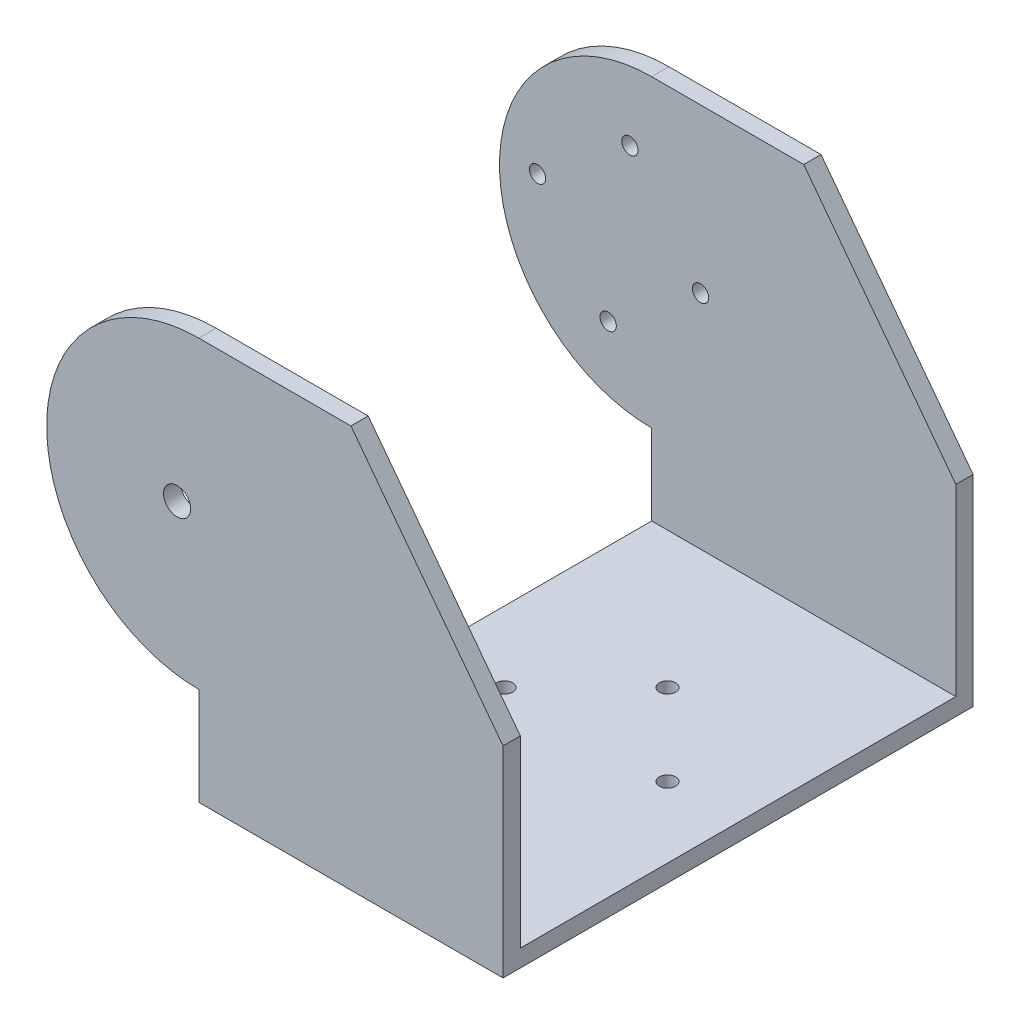
ISO-10303-21;
HEADER;
FILE_DESCRIPTION(('STEP AP214'),'2;1');
FILE_NAME('part.step','',(''),(''),'','','');
FILE_SCHEMA(('AUTOMOTIVE_DESIGN { 1 0 10303 214 1 1 1 1 }'));
ENDSEC;
DATA;
#1=APPLICATION_CONTEXT('core data for automotive mechanical design processes');
#2=APPLICATION_PROTOCOL_DEFINITION('international standard','automotive_design',2000,#1);
#3=PRODUCT_CONTEXT('',#1,'mechanical');
#4=PRODUCT('Part','Part','',(#3));
#5=PRODUCT_RELATED_PRODUCT_CATEGORY('part','',(#4));
#6=PRODUCT_DEFINITION_FORMATION('','',#4);
#7=PRODUCT_DEFINITION_CONTEXT('part definition',#1,'design');
#8=PRODUCT_DEFINITION('design','',#6,#7);
#9=PRODUCT_DEFINITION_SHAPE('','',#8);
#10=(LENGTH_UNIT() NAMED_UNIT(*) SI_UNIT(.MILLI.,.METRE.));
#11=(NAMED_UNIT(*) PLANE_ANGLE_UNIT() SI_UNIT($,.RADIAN.));
#12=(NAMED_UNIT(*) SI_UNIT($,.STERADIAN.) SOLID_ANGLE_UNIT());
#13=UNCERTAINTY_MEASURE_WITH_UNIT(LENGTH_MEASURE(1.E-05),#10,'distance_accuracy_value','');
#14=(GEOMETRIC_REPRESENTATION_CONTEXT(3) GLOBAL_UNCERTAINTY_ASSIGNED_CONTEXT((#13)) GLOBAL_UNIT_ASSIGNED_CONTEXT((#10,
#11,#12)) REPRESENTATION_CONTEXT('',''));
#15=CARTESIAN_POINT('',(0.,0.,0.));
#16=DIRECTION('',(0.,0.,1.));
#17=DIRECTION('',(1.,0.,0.));
#18=AXIS2_PLACEMENT_3D('',#15,#16,#17);
#19=CARTESIAN_POINT('',(0.,1.59,0.));
#20=DIRECTION('',(0.,1.,0.));
#21=DIRECTION('',(0.,0.,1.));
#22=AXIS2_PLACEMENT_3D('',#19,#20,#21);
#23=PLANE('',#22);
#24=CARTESIAN_POINT('',(7.5,1.59,0.));
#25=DIRECTION('',(0.,1.,0.));
#26=DIRECTION('',(0.,0.,1.));
#27=AXIS2_PLACEMENT_3D('',#24,#25,#26);
#28=CIRCLE('',#27,0.75);
#29=CARTESIAN_POINT('',(7.5,1.59,-0.75));
#30=VERTEX_POINT('',#29);
#31=EDGE_CURVE('E174',#30,#30,#28,.T.);
#32=ORIENTED_EDGE('',*,*,#31,.F.);
#33=EDGE_LOOP('',(#32));
#34=FACE_BOUND('',#33,.T.);
#35=CARTESIAN_POINT('',(0.,1.59,-7.5));
#36=DIRECTION('',(0.,1.,0.));
#37=DIRECTION('',(0.,0.,1.));
#38=AXIS2_PLACEMENT_3D('',#35,#36,#37);
#39=CIRCLE('',#38,0.75);
#40=CARTESIAN_POINT('',(0.,1.59,-8.25));
#41=VERTEX_POINT('',#40);
#42=EDGE_CURVE('E186',#41,#41,#39,.T.);
#43=ORIENTED_EDGE('',*,*,#42,.F.);
#44=EDGE_LOOP('',(#43));
#45=FACE_BOUND('',#44,.T.);
#46=CARTESIAN_POINT('',(0.,1.59,7.5));
#47=DIRECTION('',(0.,1.,0.));
#48=DIRECTION('',(0.,0.,1.));
#49=AXIS2_PLACEMENT_3D('',#46,#47,#48);
#50=CIRCLE('',#49,0.75);
#51=CARTESIAN_POINT('',(0.,1.59,6.75));
#52=VERTEX_POINT('',#51);
#53=EDGE_CURVE('E180',#52,#52,#50,.T.);
#54=ORIENTED_EDGE('',*,*,#53,.F.);
#55=EDGE_LOOP('',(#54));
#56=FACE_BOUND('',#55,.T.);
#57=CARTESIAN_POINT('',(-7.5,1.59,0.));
#58=DIRECTION('',(0.,1.,0.));
#59=DIRECTION('',(0.,0.,1.));
#60=AXIS2_PLACEMENT_3D('',#57,#58,#59);
#61=CIRCLE('',#60,0.75);
#62=CARTESIAN_POINT('',(-7.5,1.59,-0.75));
#63=VERTEX_POINT('',#62);
#64=EDGE_CURVE('E168',#63,#63,#61,.T.);
#65=ORIENTED_EDGE('',*,*,#64,.F.);
#66=EDGE_LOOP('',(#65));
#67=FACE_BOUND('',#66,.T.);
#68=DIRECTION('',(0.,0.,1.));
#69=VECTOR('',#68,1.);
#70=CARTESIAN_POINT('',(-14.,1.59,-21.632));
#71=LINE('',#70,#69);
#72=CARTESIAN_POINT('',(-14.,1.59,-20.042));
#73=VERTEX_POINT('',#72);
#74=CARTESIAN_POINT('',(-14.,1.59,20.042));
#75=VERTEX_POINT('',#74);
#76=EDGE_CURVE('E195',#73,#75,#71,.T.);
#77=ORIENTED_EDGE('',*,*,#76,.T.);
#78=DIRECTION('',(-1.,0.,0.));
#79=VECTOR('',#78,1.);
#80=CARTESIAN_POINT('',(-14.,1.59,20.042));
#81=LINE('',#80,#79);
#82=CARTESIAN_POINT('',(14.,1.59,20.042));
#83=VERTEX_POINT('',#82);
#84=EDGE_CURVE('E142',#83,#75,#81,.T.);
#85=ORIENTED_EDGE('',*,*,#84,.F.);
#86=DIRECTION('',(0.,0.,-1.));
#87=VECTOR('',#86,1.);
#88=CARTESIAN_POINT('',(14.,1.59,-21.632));
#89=LINE('',#88,#87);
#90=CARTESIAN_POINT('',(14.,1.59,-20.042));
#91=VERTEX_POINT('',#90);
#92=EDGE_CURVE('E192',#83,#91,#89,.T.);
#93=ORIENTED_EDGE('',*,*,#92,.T.);
#94=DIRECTION('',(1.,0.,0.));
#95=VECTOR('',#94,1.);
#96=CARTESIAN_POINT('',(-14.,1.59,-20.042));
#97=LINE('',#96,#95);
#98=EDGE_CURVE('E152',#73,#91,#97,.T.);
#99=ORIENTED_EDGE('',*,*,#98,.F.);
#100=EDGE_LOOP('',(#77,#85,#93,#99));
#101=FACE_BOUND('',#100,.T.);
#102=ADVANCED_FACE('F32',(#34,#45,#56,#67,#101),#23,.T.);
#103=CARTESIAN_POINT('',(0.,0.,0.));
#104=DIRECTION('',(0.,1.,0.));
#105=DIRECTION('',(0.,0.,1.));
#106=AXIS2_PLACEMENT_3D('',#103,#104,#105);
#107=PLANE('',#106);
#108=DIRECTION('',(0.,0.,-1.));
#109=VECTOR('',#108,1.);
#110=CARTESIAN_POINT('',(14.,0.,-21.632));
#111=LINE('',#110,#109);
#112=CARTESIAN_POINT('',(14.,0.,21.632));
#113=VERTEX_POINT('',#112);
#114=CARTESIAN_POINT('',(14.,0.,-21.632));
#115=VERTEX_POINT('',#114);
#116=EDGE_CURVE('E189',#113,#115,#111,.T.);
#117=ORIENTED_EDGE('',*,*,#116,.F.);
#118=DIRECTION('',(1.,0.,0.));
#119=VECTOR('',#118,1.);
#120=CARTESIAN_POINT('',(-14.,0.,21.632));
#121=LINE('',#120,#119);
#122=CARTESIAN_POINT('',(-14.,0.,21.632));
#123=VERTEX_POINT('',#122);
#124=EDGE_CURVE('E196',#123,#113,#121,.T.);
#125=ORIENTED_EDGE('',*,*,#124,.F.);
#126=DIRECTION('',(0.,0.,1.));
#127=VECTOR('',#126,1.);
#128=CARTESIAN_POINT('',(-14.,0.,-21.632));
#129=LINE('',#128,#127);
#130=CARTESIAN_POINT('',(-14.,0.,-21.632));
#131=VERTEX_POINT('',#130);
#132=EDGE_CURVE('E204',#131,#123,#129,.T.);
#133=ORIENTED_EDGE('',*,*,#132,.F.);
#134=DIRECTION('',(-1.,0.,0.));
#135=VECTOR('',#134,1.);
#136=CARTESIAN_POINT('',(-14.,0.,-21.632));
#137=LINE('',#136,#135);
#138=EDGE_CURVE('E201',#115,#131,#137,.T.);
#139=ORIENTED_EDGE('',*,*,#138,.F.);
#140=EDGE_LOOP('',(#117,#125,#133,#139));
#141=FACE_BOUND('',#140,.T.);
#142=CARTESIAN_POINT('',(0.,0.,-7.5));
#143=DIRECTION('',(0.,1.,0.));
#144=DIRECTION('',(0.,0.,1.));
#145=AXIS2_PLACEMENT_3D('',#142,#143,#144);
#146=CIRCLE('',#145,0.75);
#147=CARTESIAN_POINT('',(0.,0.,-8.25));
#148=VERTEX_POINT('',#147);
#149=EDGE_CURVE('E183',#148,#148,#146,.T.);
#150=ORIENTED_EDGE('',*,*,#149,.T.);
#151=EDGE_LOOP('',(#150));
#152=FACE_BOUND('',#151,.T.);
#153=CARTESIAN_POINT('',(0.,0.,7.5));
#154=DIRECTION('',(0.,1.,0.));
#155=DIRECTION('',(0.,0.,1.));
#156=AXIS2_PLACEMENT_3D('',#153,#154,#155);
#157=CIRCLE('',#156,0.75);
#158=CARTESIAN_POINT('',(0.,0.,6.75));
#159=VERTEX_POINT('',#158);
#160=EDGE_CURVE('E177',#159,#159,#157,.T.);
#161=ORIENTED_EDGE('',*,*,#160,.T.);
#162=EDGE_LOOP('',(#161));
#163=FACE_BOUND('',#162,.T.);
#164=CARTESIAN_POINT('',(7.5,0.,0.));
#165=DIRECTION('',(0.,1.,0.));
#166=DIRECTION('',(0.,0.,1.));
#167=AXIS2_PLACEMENT_3D('',#164,#165,#166);
#168=CIRCLE('',#167,0.75);
#169=CARTESIAN_POINT('',(7.5,0.,-0.75));
#170=VERTEX_POINT('',#169);
#171=EDGE_CURVE('E171',#170,#170,#168,.T.);
#172=ORIENTED_EDGE('',*,*,#171,.T.);
#173=EDGE_LOOP('',(#172));
#174=FACE_BOUND('',#173,.T.);
#175=CARTESIAN_POINT('',(-7.5,0.,0.));
#176=DIRECTION('',(0.,1.,0.));
#177=DIRECTION('',(0.,0.,1.));
#178=AXIS2_PLACEMENT_3D('',#175,#176,#177);
#179=CIRCLE('',#178,0.75);
#180=CARTESIAN_POINT('',(-7.5,0.,-0.75));
#181=VERTEX_POINT('',#180);
#182=EDGE_CURVE('E167',#181,#181,#179,.T.);
#183=ORIENTED_EDGE('',*,*,#182,.T.);
#184=EDGE_LOOP('',(#183));
#185=FACE_BOUND('',#184,.T.);
#186=ADVANCED_FACE('F280',(#141,#152,#163,#174,#185),#107,.F.);
#187=CARTESIAN_POINT('',(14.,1.59,-21.632));
#188=DIRECTION('',(-1.,0.,0.));
#189=DIRECTION('',(0.,0.,1.));
#190=AXIS2_PLACEMENT_3D('',#187,#188,#189);
#191=PLANE('',#190);
#192=DIRECTION('',(0.,-1.,0.));
#193=VECTOR('',#192,1.);
#194=CARTESIAN_POINT('',(14.,1.59,-21.632));
#195=LINE('',#194,#193);
#196=CARTESIAN_POINT('',(14.,18.5,-21.632));
#197=VERTEX_POINT('',#196);
#198=EDGE_CURVE('E40',#197,#115,#195,.T.);
#199=ORIENTED_EDGE('',*,*,#198,.F.);
#200=DIRECTION('',(0.,0.,1.));
#201=VECTOR('',#200,1.);
#202=CARTESIAN_POINT('',(14.,18.5,-44.8322155162404));
#203=LINE('',#202,#201);
#204=CARTESIAN_POINT('',(14.,18.5,-20.042));
#205=VERTEX_POINT('',#204);
#206=EDGE_CURVE('E300',#197,#205,#203,.T.);
#207=ORIENTED_EDGE('',*,*,#206,.T.);
#208=DIRECTION('',(0.,-1.,0.));
#209=VECTOR('',#208,1.);
#210=CARTESIAN_POINT('',(14.,37.,-20.042));
#211=LINE('',#210,#209);
#212=EDGE_CURVE('E161',#205,#91,#211,.T.);
#213=ORIENTED_EDGE('',*,*,#212,.T.);
#214=ORIENTED_EDGE('',*,*,#92,.F.);
#215=DIRECTION('',(0.,-1.,0.));
#216=VECTOR('',#215,1.);
#217=CARTESIAN_POINT('',(14.,37.,20.042));
#218=LINE('',#217,#216);
#219=CARTESIAN_POINT('',(14.,18.5,20.042));
#220=VERTEX_POINT('',#219);
#221=EDGE_CURVE('E150',#220,#83,#218,.T.);
#222=ORIENTED_EDGE('',*,*,#221,.F.);
#223=CARTESIAN_POINT('',(14.,18.5,21.632));
#224=VERTEX_POINT('',#223);
#225=EDGE_CURVE('E305',#220,#224,#203,.T.);
#226=ORIENTED_EDGE('',*,*,#225,.T.);
#227=DIRECTION('',(0.,-1.,0.));
#228=VECTOR('',#227,1.);
#229=CARTESIAN_POINT('',(14.,1.59,21.632));
#230=LINE('',#229,#228);
#231=EDGE_CURVE('E132',#224,#113,#230,.T.);
#232=ORIENTED_EDGE('',*,*,#231,.T.);
#233=ORIENTED_EDGE('',*,*,#116,.T.);
#234=EDGE_LOOP('',(#199,#207,#213,#214,#222,#226,#232,#233));
#235=FACE_BOUND('',#234,.T.);
#236=ADVANCED_FACE('F34',(#235),#191,.F.);
#237=CARTESIAN_POINT('',(-14.,1.59,-21.632));
#238=DIRECTION('',(0.,0.,1.));
#239=DIRECTION('',(1.,0.,0.));
#240=AXIS2_PLACEMENT_3D('',#237,#238,#239);
#241=PLANE('',#240);
#242=CARTESIAN_POINT('',(-24.5000000000002,24.0000000000002,-21.632));
#243=DIRECTION('',(0.,0.,-1.));
#244=DIRECTION('',(-1.,0.,0.));
#245=AXIS2_PLACEMENT_3D('',#242,#243,#244);
#246=CIRCLE('',#245,0.750000000000002);
#247=CARTESIAN_POINT('',(-25.2500000000002,24.0000000000002,-21.632));
#248=VERTEX_POINT('',#247);
#249=EDGE_CURVE('E223',#248,#248,#246,.T.);
#250=ORIENTED_EDGE('',*,*,#249,.F.);
#251=EDGE_LOOP('',(#250));
#252=FACE_BOUND('',#251,.T.);
#253=CARTESIAN_POINT('',(-18.0000000000004,15.5,-21.632));
#254=DIRECTION('',(0.,0.,-1.));
#255=DIRECTION('',(-1.,0.,0.));
#256=AXIS2_PLACEMENT_3D('',#253,#254,#255);
#257=CIRCLE('',#256,0.750000000000005);
#258=CARTESIAN_POINT('',(-18.7500000000004,15.5,-21.632));
#259=VERTEX_POINT('',#258);
#260=EDGE_CURVE('E235',#259,#259,#257,.T.);
#261=ORIENTED_EDGE('',*,*,#260,.F.);
#262=EDGE_LOOP('',(#261));
#263=FACE_BOUND('',#262,.T.);
#264=CARTESIAN_POINT('',(-9.5000000000002,21.9999999999998,-21.632));
#265=DIRECTION('',(0.,0.,-1.));
#266=DIRECTION('',(-1.,0.,0.));
#267=AXIS2_PLACEMENT_3D('',#264,#265,#266);
#268=CIRCLE('',#267,0.750000000000004);
#269=CARTESIAN_POINT('',(-10.2500000000002,21.9999999999998,-21.632));
#270=VERTEX_POINT('',#269);
#271=EDGE_CURVE('E230',#270,#270,#268,.T.);
#272=ORIENTED_EDGE('',*,*,#271,.F.);
#273=EDGE_LOOP('',(#272));
#274=FACE_BOUND('',#273,.T.);
#275=CARTESIAN_POINT('',(-16.,30.5,-21.632));
#276=DIRECTION('',(0.,0.,-1.));
#277=DIRECTION('',(-1.,0.,0.));
#278=AXIS2_PLACEMENT_3D('',#275,#276,#277);
#279=CIRCLE('',#278,0.750000000000002);
#280=CARTESIAN_POINT('',(-16.75,30.5,-21.632));
#281=VERTEX_POINT('',#280);
#282=EDGE_CURVE('E218',#281,#281,#279,.T.);
#283=ORIENTED_EDGE('',*,*,#282,.F.);
#284=EDGE_LOOP('',(#283));
#285=FACE_BOUND('',#284,.T.);
#286=DIRECTION('',(-1.,0.,0.));
#287=VECTOR('',#286,1.);
#288=CARTESIAN_POINT('',(-14.,37.,-21.632));
#289=LINE('',#288,#287);
#290=CARTESIAN_POINT('',(0.,37.,-21.632));
#291=VERTEX_POINT('',#290);
#292=CARTESIAN_POINT('',(-14.,37.,-21.632));
#293=VERTEX_POINT('',#292);
#294=EDGE_CURVE('E159',#291,#293,#289,.T.);
#295=ORIENTED_EDGE('',*,*,#294,.F.);
#296=DIRECTION('',(-0.603442670185537,0.797406385602316,0.));
#297=VECTOR('',#296,1.);
#298=CARTESIAN_POINT('',(0.,37.,-21.632));
#299=LINE('',#298,#297);
#300=EDGE_CURVE('E47',#197,#291,#299,.T.);
#301=ORIENTED_EDGE('',*,*,#300,.F.);
#302=ORIENTED_EDGE('',*,*,#198,.T.);
#303=ORIENTED_EDGE('',*,*,#138,.T.);
#304=DIRECTION('',(0.,-1.,0.));
#305=VECTOR('',#304,1.);
#306=CARTESIAN_POINT('',(-14.,1.59,-21.632));
#307=LINE('',#306,#305);
#308=CARTESIAN_POINT('',(-14.,9.,-21.632));
#309=VERTEX_POINT('',#308);
#310=EDGE_CURVE('E211',#309,#131,#307,.T.);
#311=ORIENTED_EDGE('',*,*,#310,.F.);
#312=CARTESIAN_POINT('',(-14.,23.,-21.632));
#313=DIRECTION('',(0.,0.,-1.));
#314=DIRECTION('',(-1.,0.,0.));
#315=AXIS2_PLACEMENT_3D('',#312,#313,#314);
#316=CIRCLE('',#315,14.);
#317=EDGE_CURVE('E255',#309,#293,#316,.T.);
#318=ORIENTED_EDGE('',*,*,#317,.T.);
#319=EDGE_LOOP('',(#295,#301,#302,#303,#311,#318));
#320=FACE_BOUND('',#319,.T.);
#321=ADVANCED_FACE('F273',(#252,#263,#274,#285,#320),#241,.F.);
#322=CARTESIAN_POINT('',(-14.,1.59,-21.632));
#323=DIRECTION('',(1.,0.,0.));
#324=DIRECTION('',(0.,0.,-1.));
#325=AXIS2_PLACEMENT_3D('',#322,#323,#324);
#326=PLANE('',#325);
#327=DIRECTION('',(0.,-1.,0.));
#328=VECTOR('',#327,1.);
#329=CARTESIAN_POINT('',(-14.,1.59,21.632));
#330=LINE('',#329,#328);
#331=CARTESIAN_POINT('',(-14.,9.,21.632));
#332=VERTEX_POINT('',#331);
#333=EDGE_CURVE('E209',#332,#123,#330,.T.);
#334=ORIENTED_EDGE('',*,*,#333,.F.);
#335=DIRECTION('',(0.,0.,1.));
#336=VECTOR('',#335,1.);
#337=CARTESIAN_POINT('',(-14.,9.,-11.2629516849971));
#338=LINE('',#337,#336);
#339=CARTESIAN_POINT('',(-14.,9.,20.042));
#340=VERTEX_POINT('',#339);
#341=EDGE_CURVE('E256',#340,#332,#338,.T.);
#342=ORIENTED_EDGE('',*,*,#341,.F.);
#343=DIRECTION('',(0.,-1.,0.));
#344=VECTOR('',#343,1.);
#345=CARTESIAN_POINT('',(-14.,37.,20.042));
#346=LINE('',#345,#344);
#347=EDGE_CURVE('E140',#340,#75,#346,.T.);
#348=ORIENTED_EDGE('',*,*,#347,.T.);
#349=ORIENTED_EDGE('',*,*,#76,.F.);
#350=DIRECTION('',(0.,-1.,0.));
#351=VECTOR('',#350,1.);
#352=CARTESIAN_POINT('',(-14.,37.,-20.042));
#353=LINE('',#352,#351);
#354=CARTESIAN_POINT('',(-14.,9.,-20.042));
#355=VERTEX_POINT('',#354);
#356=EDGE_CURVE('E165',#355,#73,#353,.T.);
#357=ORIENTED_EDGE('',*,*,#356,.F.);
#358=DIRECTION('',(0.,0.,-1.));
#359=VECTOR('',#358,1.);
#360=CARTESIAN_POINT('',(-14.,9.,11.2629516849971));
#361=LINE('',#360,#359);
#362=EDGE_CURVE('E260',#355,#309,#361,.T.);
#363=ORIENTED_EDGE('',*,*,#362,.T.);
#364=ORIENTED_EDGE('',*,*,#310,.T.);
#365=ORIENTED_EDGE('',*,*,#132,.T.);
#366=EDGE_LOOP('',(#334,#342,#348,#349,#357,#363,#364,#365));
#367=FACE_BOUND('',#366,.T.);
#368=ADVANCED_FACE('F268',(#367),#326,.F.);
#369=CARTESIAN_POINT('',(-14.,1.59,21.632));
#370=DIRECTION('',(0.,0.,-1.));
#371=DIRECTION('',(-1.,0.,0.));
#372=AXIS2_PLACEMENT_3D('',#369,#370,#371);
#373=PLANE('',#372);
#374=CARTESIAN_POINT('',(-16.,23.,21.632));
#375=DIRECTION('',(0.,0.,1.));
#376=DIRECTION('',(1.,0.,0.));
#377=AXIS2_PLACEMENT_3D('',#374,#375,#376);
#378=CIRCLE('',#377,1.25);
#379=CARTESIAN_POINT('',(-14.75,23.,21.632));
#380=VERTEX_POINT('',#379);
#381=EDGE_CURVE('E231',#380,#380,#378,.T.);
#382=ORIENTED_EDGE('',*,*,#381,.F.);
#383=EDGE_LOOP('',(#382));
#384=FACE_BOUND('',#383,.T.);
#385=ORIENTED_EDGE('',*,*,#231,.F.);
#386=DIRECTION('',(0.603442670185537,-0.797406385602316,0.));
#387=VECTOR('',#386,1.);
#388=CARTESIAN_POINT('',(0.,37.,21.632));
#389=LINE('',#388,#387);
#390=CARTESIAN_POINT('',(0.,37.,21.632));
#391=VERTEX_POINT('',#390);
#392=EDGE_CURVE('E119',#391,#224,#389,.T.);
#393=ORIENTED_EDGE('',*,*,#392,.F.);
#394=DIRECTION('',(1.,0.,0.));
#395=VECTOR('',#394,1.);
#396=CARTESIAN_POINT('',(-14.,37.,21.632));
#397=LINE('',#396,#395);
#398=CARTESIAN_POINT('',(-14.,37.,21.632));
#399=VERTEX_POINT('',#398);
#400=EDGE_CURVE('E129',#399,#391,#397,.T.);
#401=ORIENTED_EDGE('',*,*,#400,.F.);
#402=CARTESIAN_POINT('',(-14.,23.,21.632));
#403=DIRECTION('',(0.,0.,1.));
#404=DIRECTION('',(1.,0.,0.));
#405=AXIS2_PLACEMENT_3D('',#402,#403,#404);
#406=CIRCLE('',#405,14.);
#407=EDGE_CURVE('E217',#399,#332,#406,.T.);
#408=ORIENTED_EDGE('',*,*,#407,.T.);
#409=ORIENTED_EDGE('',*,*,#333,.T.);
#410=ORIENTED_EDGE('',*,*,#124,.T.);
#411=EDGE_LOOP('',(#385,#393,#401,#408,#409,#410));
#412=FACE_BOUND('',#411,.T.);
#413=ADVANCED_FACE('F127',(#384,#412),#373,.F.);
#414=CARTESIAN_POINT('',(0.,1.59,-7.5));
#415=DIRECTION('',(0.,-1.,0.));
#416=DIRECTION('',(0.,0.,-1.));
#417=AXIS2_PLACEMENT_3D('',#414,#415,#416);
#418=CYLINDRICAL_SURFACE('',#417,0.75);
#419=CARTESIAN_POINT('',(0.,1.59,-8.25));
#420=CARTESIAN_POINT('',(0.,1.5734375,-8.25));
#421=CARTESIAN_POINT('',(0.,1.556875,-8.25));
#422=CARTESIAN_POINT('',(0.,1.52375,-8.25));
#423=CARTESIAN_POINT('',(0.,1.5071875,-8.25));
#424=CARTESIAN_POINT('',(0.,1.4740625,-8.25));
#425=CARTESIAN_POINT('',(0.,1.4575,-8.25));
#426=CARTESIAN_POINT('',(0.,1.424375,-8.25));
#427=CARTESIAN_POINT('',(0.,1.4078125,-8.25));
#428=CARTESIAN_POINT('',(0.,1.3746875,-8.25));
#429=CARTESIAN_POINT('',(0.,1.358125,-8.25));
#430=CARTESIAN_POINT('',(0.,1.325,-8.25));
#431=CARTESIAN_POINT('',(0.,1.3084375,-8.25));
#432=CARTESIAN_POINT('',(0.,1.2753125,-8.25));
#433=CARTESIAN_POINT('',(0.,1.25875,-8.25));
#434=CARTESIAN_POINT('',(0.,1.225625,-8.25));
#435=CARTESIAN_POINT('',(0.,1.2090625,-8.25));
#436=CARTESIAN_POINT('',(0.,1.1759375,-8.25));
#437=CARTESIAN_POINT('',(0.,1.159375,-8.25));
#438=CARTESIAN_POINT('',(0.,1.12625,-8.25));
#439=CARTESIAN_POINT('',(0.,1.1096875,-8.25));
#440=CARTESIAN_POINT('',(0.,1.0765625,-8.25));
#441=CARTESIAN_POINT('',(0.,1.06,-8.25));
#442=CARTESIAN_POINT('',(0.,1.026875,-8.25));
#443=CARTESIAN_POINT('',(0.,1.0103125,-8.25));
#444=CARTESIAN_POINT('',(0.,0.9771875,-8.25));
#445=CARTESIAN_POINT('',(0.,0.960625,-8.25));
#446=CARTESIAN_POINT('',(0.,0.9275,-8.25));
#447=CARTESIAN_POINT('',(0.,0.9109375,-8.25));
#448=CARTESIAN_POINT('',(0.,0.8778125,-8.25));
#449=CARTESIAN_POINT('',(0.,0.86125,-8.25));
#450=CARTESIAN_POINT('',(0.,0.828125,-8.25));
#451=CARTESIAN_POINT('',(0.,0.8115625,-8.25));
#452=CARTESIAN_POINT('',(0.,0.7784375,-8.25));
#453=CARTESIAN_POINT('',(0.,0.761875,-8.25));
#454=CARTESIAN_POINT('',(0.,0.72875,-8.25));
#455=CARTESIAN_POINT('',(0.,0.7121875,-8.25));
#456=CARTESIAN_POINT('',(0.,0.6790625,-8.25));
#457=CARTESIAN_POINT('',(0.,0.6625,-8.25));
#458=CARTESIAN_POINT('',(0.,0.629375,-8.25));
#459=CARTESIAN_POINT('',(0.,0.6128125,-8.25));
#460=CARTESIAN_POINT('',(0.,0.5796875,-8.25));
#461=CARTESIAN_POINT('',(0.,0.563125,-8.25));
#462=CARTESIAN_POINT('',(0.,0.53,-8.25));
#463=CARTESIAN_POINT('',(0.,0.5134375,-8.25));
#464=CARTESIAN_POINT('',(0.,0.4803125,-8.25));
#465=CARTESIAN_POINT('',(0.,0.46375,-8.25));
#466=CARTESIAN_POINT('',(0.,0.430625,-8.25));
#467=CARTESIAN_POINT('',(0.,0.4140625,-8.25));
#468=CARTESIAN_POINT('',(0.,0.3809375,-8.25));
#469=CARTESIAN_POINT('',(0.,0.364375,-8.25));
#470=CARTESIAN_POINT('',(0.,0.33125,-8.25));
#471=CARTESIAN_POINT('',(0.,0.3146875,-8.25));
#472=CARTESIAN_POINT('',(0.,0.2815625,-8.25));
#473=CARTESIAN_POINT('',(0.,0.265,-8.25));
#474=CARTESIAN_POINT('',(0.,0.231875,-8.25));
#475=CARTESIAN_POINT('',(0.,0.2153125,-8.25));
#476=CARTESIAN_POINT('',(0.,0.1821875,-8.25));
#477=CARTESIAN_POINT('',(0.,0.165625,-8.25));
#478=CARTESIAN_POINT('',(0.,0.1325,-8.25));
#479=CARTESIAN_POINT('',(0.,0.1159375,-8.25));
#480=CARTESIAN_POINT('',(0.,0.0828125000000001,-8.25));
#481=CARTESIAN_POINT('',(0.,0.06625,-8.25));
#482=CARTESIAN_POINT('',(0.,0.033125,-8.25));
#483=CARTESIAN_POINT('',(0.,0.0165625,-8.25));
#484=CARTESIAN_POINT('',(0.,0.,-8.25));
#485=B_SPLINE_CURVE_WITH_KNOTS('',3,(#419,#420,#421,#422,#423,#424,#425,#426,#427,#428,#429,
#430,#431,#432,#433,#434,#435,#436,#437,#438,#439,#440,#441,#442,#443,#444,#445,#446,#447,#448,
#449,#450,#451,#452,#453,#454,#455,#456,#457,#458,#459,#460,#461,#462,#463,#464,#465,#466,#467,
#468,#469,#470,#471,#472,#473,#474,#475,#476,#477,#478,#479,#480,#481,#482,#483,#484),
.UNSPECIFIED.,.F.,.F.,(4,2,2,2,2,2,2,2,2,2,2,2,2,2,2,2,2,2,2,2,2,2,2,2,2,2,2,2,2,2,2,2,4),(0.,
0.0496874999999998,0.0993749999999999,0.1490625,0.19875,0.2484375,0.298125,0.3478125,0.3975,
0.4471875,0.496875,0.5465625,0.59625,0.6459375,0.695625,0.7453125,0.795,0.8446875,0.894375,
0.9440625,0.99375,1.0434375,1.093125,1.1428125,1.1925,1.2421875,1.291875,1.3415625,1.39125,
1.4409375,1.490625,1.5403125,1.59),.UNSPECIFIED.);
#486=EDGE_CURVE('BSEAM326',#41,#148,#485,.T.);
#487=ORIENTED_EDGE('',*,*,#42,.T.);
#488=ORIENTED_EDGE('',*,*,#149,.F.);
#489=ORIENTED_EDGE('',*,*,#486,.T.);
#490=ORIENTED_EDGE('',*,*,#486,.F.);
#491=EDGE_LOOP('',(#487,#489,#488,#490));
#492=FACE_BOUND('',#491,.T.);
#493=ADVANCED_FACE('F326',(#492),#418,.F.);
#494=CARTESIAN_POINT('',(0.,1.59,7.5));
#495=DIRECTION('',(0.,-1.,0.));
#496=DIRECTION('',(0.,0.,-1.));
#497=AXIS2_PLACEMENT_3D('',#494,#495,#496);
#498=CYLINDRICAL_SURFACE('',#497,0.75);
#499=CARTESIAN_POINT('',(0.,1.59,6.75));
#500=CARTESIAN_POINT('',(0.,1.5734375,6.75));
#501=CARTESIAN_POINT('',(0.,1.556875,6.75));
#502=CARTESIAN_POINT('',(0.,1.52375,6.75));
#503=CARTESIAN_POINT('',(0.,1.5071875,6.75));
#504=CARTESIAN_POINT('',(0.,1.4740625,6.75));
#505=CARTESIAN_POINT('',(0.,1.4575,6.75));
#506=CARTESIAN_POINT('',(0.,1.424375,6.75));
#507=CARTESIAN_POINT('',(0.,1.4078125,6.75));
#508=CARTESIAN_POINT('',(0.,1.3746875,6.75));
#509=CARTESIAN_POINT('',(0.,1.358125,6.75));
#510=CARTESIAN_POINT('',(0.,1.325,6.75));
#511=CARTESIAN_POINT('',(0.,1.3084375,6.75));
#512=CARTESIAN_POINT('',(0.,1.2753125,6.75));
#513=CARTESIAN_POINT('',(0.,1.25875,6.75));
#514=CARTESIAN_POINT('',(0.,1.225625,6.75));
#515=CARTESIAN_POINT('',(0.,1.2090625,6.75));
#516=CARTESIAN_POINT('',(0.,1.1759375,6.75));
#517=CARTESIAN_POINT('',(0.,1.159375,6.75));
#518=CARTESIAN_POINT('',(0.,1.12625,6.75));
#519=CARTESIAN_POINT('',(0.,1.1096875,6.75));
#520=CARTESIAN_POINT('',(0.,1.0765625,6.75));
#521=CARTESIAN_POINT('',(0.,1.06,6.75));
#522=CARTESIAN_POINT('',(0.,1.026875,6.75));
#523=CARTESIAN_POINT('',(0.,1.0103125,6.75));
#524=CARTESIAN_POINT('',(0.,0.9771875,6.75));
#525=CARTESIAN_POINT('',(0.,0.960625,6.75));
#526=CARTESIAN_POINT('',(0.,0.9275,6.75));
#527=CARTESIAN_POINT('',(0.,0.9109375,6.75));
#528=CARTESIAN_POINT('',(0.,0.8778125,6.75));
#529=CARTESIAN_POINT('',(0.,0.86125,6.75));
#530=CARTESIAN_POINT('',(0.,0.828125,6.75));
#531=CARTESIAN_POINT('',(0.,0.8115625,6.75));
#532=CARTESIAN_POINT('',(0.,0.7784375,6.75));
#533=CARTESIAN_POINT('',(0.,0.761875,6.75));
#534=CARTESIAN_POINT('',(0.,0.72875,6.75));
#535=CARTESIAN_POINT('',(0.,0.7121875,6.75));
#536=CARTESIAN_POINT('',(0.,0.6790625,6.75));
#537=CARTESIAN_POINT('',(0.,0.6625,6.75));
#538=CARTESIAN_POINT('',(0.,0.629375,6.75));
#539=CARTESIAN_POINT('',(0.,0.6128125,6.75));
#540=CARTESIAN_POINT('',(0.,0.5796875,6.75));
#541=CARTESIAN_POINT('',(0.,0.563125,6.75));
#542=CARTESIAN_POINT('',(0.,0.53,6.75));
#543=CARTESIAN_POINT('',(0.,0.5134375,6.75));
#544=CARTESIAN_POINT('',(0.,0.4803125,6.75));
#545=CARTESIAN_POINT('',(0.,0.46375,6.75));
#546=CARTESIAN_POINT('',(0.,0.430625,6.75));
#547=CARTESIAN_POINT('',(0.,0.4140625,6.75));
#548=CARTESIAN_POINT('',(0.,0.3809375,6.75));
#549=CARTESIAN_POINT('',(0.,0.364375,6.75));
#550=CARTESIAN_POINT('',(0.,0.33125,6.75));
#551=CARTESIAN_POINT('',(0.,0.3146875,6.75));
#552=CARTESIAN_POINT('',(0.,0.2815625,6.75));
#553=CARTESIAN_POINT('',(0.,0.265,6.75));
#554=CARTESIAN_POINT('',(0.,0.231875,6.75));
#555=CARTESIAN_POINT('',(0.,0.2153125,6.75));
#556=CARTESIAN_POINT('',(0.,0.1821875,6.75));
#557=CARTESIAN_POINT('',(0.,0.165625,6.75));
#558=CARTESIAN_POINT('',(0.,0.1325,6.75));
#559=CARTESIAN_POINT('',(0.,0.1159375,6.75));
#560=CARTESIAN_POINT('',(0.,0.0828125000000001,6.75));
#561=CARTESIAN_POINT('',(0.,0.06625,6.75));
#562=CARTESIAN_POINT('',(0.,0.033125,6.75));
#563=CARTESIAN_POINT('',(0.,0.0165625,6.75));
#564=CARTESIAN_POINT('',(0.,0.,6.75));
#565=B_SPLINE_CURVE_WITH_KNOTS('',3,(#499,#500,#501,#502,#503,#504,#505,#506,#507,#508,#509,
#510,#511,#512,#513,#514,#515,#516,#517,#518,#519,#520,#521,#522,#523,#524,#525,#526,#527,#528,
#529,#530,#531,#532,#533,#534,#535,#536,#537,#538,#539,#540,#541,#542,#543,#544,#545,#546,#547,
#548,#549,#550,#551,#552,#553,#554,#555,#556,#557,#558,#559,#560,#561,#562,#563,#564),
.UNSPECIFIED.,.F.,.F.,(4,2,2,2,2,2,2,2,2,2,2,2,2,2,2,2,2,2,2,2,2,2,2,2,2,2,2,2,2,2,2,2,4),(0.,
0.0496874999999998,0.0993749999999999,0.1490625,0.19875,0.2484375,0.298125,0.3478125,0.3975,
0.4471875,0.496875,0.5465625,0.59625,0.6459375,0.695625,0.7453125,0.795,0.8446875,0.894375,
0.9440625,0.99375,1.0434375,1.093125,1.1428125,1.1925,1.2421875,1.291875,1.3415625,1.39125,
1.4409375,1.490625,1.5403125,1.59),.UNSPECIFIED.);
#566=EDGE_CURVE('BSEAM369',#52,#159,#565,.T.);
#567=ORIENTED_EDGE('',*,*,#53,.T.);
#568=ORIENTED_EDGE('',*,*,#160,.F.);
#569=ORIENTED_EDGE('',*,*,#566,.T.);
#570=ORIENTED_EDGE('',*,*,#566,.F.);
#571=EDGE_LOOP('',(#567,#569,#568,#570));
#572=FACE_BOUND('',#571,.T.);
#573=ADVANCED_FACE('F369',(#572),#498,.F.);
#574=CARTESIAN_POINT('',(7.5,1.59,0.));
#575=DIRECTION('',(0.,-1.,0.));
#576=DIRECTION('',(0.,0.,-1.));
#577=AXIS2_PLACEMENT_3D('',#574,#575,#576);
#578=CYLINDRICAL_SURFACE('',#577,0.75);
#579=CARTESIAN_POINT('',(7.5,1.59,-0.75));
#580=CARTESIAN_POINT('',(7.5,1.5734375,-0.75));
#581=CARTESIAN_POINT('',(7.5,1.556875,-0.75));
#582=CARTESIAN_POINT('',(7.5,1.52375,-0.75));
#583=CARTESIAN_POINT('',(7.5,1.5071875,-0.75));
#584=CARTESIAN_POINT('',(7.5,1.4740625,-0.75));
#585=CARTESIAN_POINT('',(7.5,1.4575,-0.75));
#586=CARTESIAN_POINT('',(7.5,1.424375,-0.75));
#587=CARTESIAN_POINT('',(7.5,1.4078125,-0.75));
#588=CARTESIAN_POINT('',(7.5,1.3746875,-0.75));
#589=CARTESIAN_POINT('',(7.5,1.358125,-0.75));
#590=CARTESIAN_POINT('',(7.5,1.325,-0.75));
#591=CARTESIAN_POINT('',(7.5,1.3084375,-0.75));
#592=CARTESIAN_POINT('',(7.5,1.2753125,-0.75));
#593=CARTESIAN_POINT('',(7.5,1.25875,-0.75));
#594=CARTESIAN_POINT('',(7.5,1.225625,-0.75));
#595=CARTESIAN_POINT('',(7.5,1.2090625,-0.75));
#596=CARTESIAN_POINT('',(7.5,1.1759375,-0.75));
#597=CARTESIAN_POINT('',(7.5,1.159375,-0.75));
#598=CARTESIAN_POINT('',(7.5,1.12625,-0.75));
#599=CARTESIAN_POINT('',(7.5,1.1096875,-0.75));
#600=CARTESIAN_POINT('',(7.5,1.0765625,-0.75));
#601=CARTESIAN_POINT('',(7.5,1.06,-0.75));
#602=CARTESIAN_POINT('',(7.5,1.026875,-0.75));
#603=CARTESIAN_POINT('',(7.5,1.0103125,-0.75));
#604=CARTESIAN_POINT('',(7.5,0.9771875,-0.75));
#605=CARTESIAN_POINT('',(7.5,0.960625,-0.75));
#606=CARTESIAN_POINT('',(7.5,0.9275,-0.75));
#607=CARTESIAN_POINT('',(7.5,0.9109375,-0.75));
#608=CARTESIAN_POINT('',(7.5,0.8778125,-0.75));
#609=CARTESIAN_POINT('',(7.5,0.86125,-0.75));
#610=CARTESIAN_POINT('',(7.5,0.828125,-0.75));
#611=CARTESIAN_POINT('',(7.5,0.8115625,-0.75));
#612=CARTESIAN_POINT('',(7.5,0.7784375,-0.75));
#613=CARTESIAN_POINT('',(7.5,0.761875,-0.75));
#614=CARTESIAN_POINT('',(7.5,0.72875,-0.75));
#615=CARTESIAN_POINT('',(7.5,0.7121875,-0.75));
#616=CARTESIAN_POINT('',(7.5,0.6790625,-0.75));
#617=CARTESIAN_POINT('',(7.5,0.6625,-0.75));
#618=CARTESIAN_POINT('',(7.5,0.629375,-0.75));
#619=CARTESIAN_POINT('',(7.5,0.6128125,-0.75));
#620=CARTESIAN_POINT('',(7.5,0.5796875,-0.75));
#621=CARTESIAN_POINT('',(7.5,0.563125,-0.75));
#622=CARTESIAN_POINT('',(7.5,0.53,-0.75));
#623=CARTESIAN_POINT('',(7.5,0.5134375,-0.75));
#624=CARTESIAN_POINT('',(7.5,0.4803125,-0.75));
#625=CARTESIAN_POINT('',(7.5,0.46375,-0.75));
#626=CARTESIAN_POINT('',(7.5,0.430625,-0.75));
#627=CARTESIAN_POINT('',(7.5,0.4140625,-0.75));
#628=CARTESIAN_POINT('',(7.5,0.3809375,-0.75));
#629=CARTESIAN_POINT('',(7.5,0.364375,-0.75));
#630=CARTESIAN_POINT('',(7.5,0.33125,-0.75));
#631=CARTESIAN_POINT('',(7.5,0.3146875,-0.75));
#632=CARTESIAN_POINT('',(7.5,0.2815625,-0.75));
#633=CARTESIAN_POINT('',(7.5,0.265,-0.75));
#634=CARTESIAN_POINT('',(7.5,0.231875,-0.75));
#635=CARTESIAN_POINT('',(7.5,0.2153125,-0.75));
#636=CARTESIAN_POINT('',(7.5,0.1821875,-0.75));
#637=CARTESIAN_POINT('',(7.5,0.165625,-0.75));
#638=CARTESIAN_POINT('',(7.5,0.1325,-0.75));
#639=CARTESIAN_POINT('',(7.5,0.1159375,-0.75));
#640=CARTESIAN_POINT('',(7.5,0.0828125000000001,-0.75));
#641=CARTESIAN_POINT('',(7.5,0.06625,-0.75));
#642=CARTESIAN_POINT('',(7.5,0.033125,-0.75));
#643=CARTESIAN_POINT('',(7.5,0.0165625,-0.75));
#644=CARTESIAN_POINT('',(7.5,0.,-0.75));
#645=B_SPLINE_CURVE_WITH_KNOTS('',3,(#579,#580,#581,#582,#583,#584,#585,#586,#587,#588,#589,
#590,#591,#592,#593,#594,#595,#596,#597,#598,#599,#600,#601,#602,#603,#604,#605,#606,#607,#608,
#609,#610,#611,#612,#613,#614,#615,#616,#617,#618,#619,#620,#621,#622,#623,#624,#625,#626,#627,
#628,#629,#630,#631,#632,#633,#634,#635,#636,#637,#638,#639,#640,#641,#642,#643,#644),
.UNSPECIFIED.,.F.,.F.,(4,2,2,2,2,2,2,2,2,2,2,2,2,2,2,2,2,2,2,2,2,2,2,2,2,2,2,2,2,2,2,2,4),(0.,
0.0496874999999998,0.0993749999999999,0.1490625,0.19875,0.2484375,0.298125,0.3478125,0.3975,
0.4471875,0.496875,0.5465625,0.59625,0.6459375,0.695625,0.7453125,0.795,0.8446875,0.894375,
0.9440625,0.99375,1.0434375,1.093125,1.1428125,1.1925,1.2421875,1.291875,1.3415625,1.39125,
1.4409375,1.490625,1.5403125,1.59),.UNSPECIFIED.);
#646=EDGE_CURVE('BSEAM362',#30,#170,#645,.T.);
#647=ORIENTED_EDGE('',*,*,#31,.T.);
#648=ORIENTED_EDGE('',*,*,#171,.F.);
#649=ORIENTED_EDGE('',*,*,#646,.T.);
#650=ORIENTED_EDGE('',*,*,#646,.F.);
#651=EDGE_LOOP('',(#647,#649,#648,#650));
#652=FACE_BOUND('',#651,.T.);
#653=ADVANCED_FACE('F362',(#652),#578,.F.);
#654=CARTESIAN_POINT('',(-7.5,1.59,0.));
#655=DIRECTION('',(0.,-1.,0.));
#656=DIRECTION('',(0.,0.,-1.));
#657=AXIS2_PLACEMENT_3D('',#654,#655,#656);
#658=CYLINDRICAL_SURFACE('',#657,0.75);
#659=CARTESIAN_POINT('',(-7.5,1.59,-0.75));
#660=CARTESIAN_POINT('',(-7.5,1.5734375,-0.75));
#661=CARTESIAN_POINT('',(-7.5,1.556875,-0.75));
#662=CARTESIAN_POINT('',(-7.5,1.52375,-0.75));
#663=CARTESIAN_POINT('',(-7.5,1.5071875,-0.75));
#664=CARTESIAN_POINT('',(-7.5,1.4740625,-0.75));
#665=CARTESIAN_POINT('',(-7.5,1.4575,-0.75));
#666=CARTESIAN_POINT('',(-7.5,1.424375,-0.75));
#667=CARTESIAN_POINT('',(-7.5,1.4078125,-0.75));
#668=CARTESIAN_POINT('',(-7.5,1.3746875,-0.75));
#669=CARTESIAN_POINT('',(-7.5,1.358125,-0.75));
#670=CARTESIAN_POINT('',(-7.5,1.325,-0.75));
#671=CARTESIAN_POINT('',(-7.5,1.3084375,-0.75));
#672=CARTESIAN_POINT('',(-7.5,1.2753125,-0.75));
#673=CARTESIAN_POINT('',(-7.5,1.25875,-0.75));
#674=CARTESIAN_POINT('',(-7.5,1.225625,-0.75));
#675=CARTESIAN_POINT('',(-7.5,1.2090625,-0.75));
#676=CARTESIAN_POINT('',(-7.5,1.1759375,-0.75));
#677=CARTESIAN_POINT('',(-7.5,1.159375,-0.75));
#678=CARTESIAN_POINT('',(-7.5,1.12625,-0.75));
#679=CARTESIAN_POINT('',(-7.5,1.1096875,-0.75));
#680=CARTESIAN_POINT('',(-7.5,1.0765625,-0.75));
#681=CARTESIAN_POINT('',(-7.5,1.06,-0.75));
#682=CARTESIAN_POINT('',(-7.5,1.026875,-0.75));
#683=CARTESIAN_POINT('',(-7.5,1.0103125,-0.75));
#684=CARTESIAN_POINT('',(-7.5,0.9771875,-0.75));
#685=CARTESIAN_POINT('',(-7.5,0.960625,-0.75));
#686=CARTESIAN_POINT('',(-7.5,0.9275,-0.75));
#687=CARTESIAN_POINT('',(-7.5,0.9109375,-0.75));
#688=CARTESIAN_POINT('',(-7.5,0.8778125,-0.75));
#689=CARTESIAN_POINT('',(-7.5,0.86125,-0.75));
#690=CARTESIAN_POINT('',(-7.5,0.828125,-0.75));
#691=CARTESIAN_POINT('',(-7.5,0.8115625,-0.75));
#692=CARTESIAN_POINT('',(-7.5,0.7784375,-0.75));
#693=CARTESIAN_POINT('',(-7.5,0.761875,-0.75));
#694=CARTESIAN_POINT('',(-7.5,0.72875,-0.75));
#695=CARTESIAN_POINT('',(-7.5,0.7121875,-0.75));
#696=CARTESIAN_POINT('',(-7.5,0.6790625,-0.75));
#697=CARTESIAN_POINT('',(-7.5,0.6625,-0.75));
#698=CARTESIAN_POINT('',(-7.5,0.629375,-0.75));
#699=CARTESIAN_POINT('',(-7.5,0.6128125,-0.75));
#700=CARTESIAN_POINT('',(-7.5,0.5796875,-0.75));
#701=CARTESIAN_POINT('',(-7.5,0.563125,-0.75));
#702=CARTESIAN_POINT('',(-7.5,0.53,-0.75));
#703=CARTESIAN_POINT('',(-7.5,0.5134375,-0.75));
#704=CARTESIAN_POINT('',(-7.5,0.4803125,-0.75));
#705=CARTESIAN_POINT('',(-7.5,0.46375,-0.75));
#706=CARTESIAN_POINT('',(-7.5,0.430625,-0.75));
#707=CARTESIAN_POINT('',(-7.5,0.4140625,-0.75));
#708=CARTESIAN_POINT('',(-7.5,0.3809375,-0.75));
#709=CARTESIAN_POINT('',(-7.5,0.364375,-0.75));
#710=CARTESIAN_POINT('',(-7.5,0.33125,-0.75));
#711=CARTESIAN_POINT('',(-7.5,0.3146875,-0.75));
#712=CARTESIAN_POINT('',(-7.5,0.2815625,-0.75));
#713=CARTESIAN_POINT('',(-7.5,0.265,-0.75));
#714=CARTESIAN_POINT('',(-7.5,0.231875,-0.75));
#715=CARTESIAN_POINT('',(-7.5,0.2153125,-0.75));
#716=CARTESIAN_POINT('',(-7.5,0.1821875,-0.75));
#717=CARTESIAN_POINT('',(-7.5,0.165625,-0.75));
#718=CARTESIAN_POINT('',(-7.5,0.1325,-0.75));
#719=CARTESIAN_POINT('',(-7.5,0.1159375,-0.75));
#720=CARTESIAN_POINT('',(-7.5,0.0828125000000001,-0.75));
#721=CARTESIAN_POINT('',(-7.5,0.06625,-0.75));
#722=CARTESIAN_POINT('',(-7.5,0.033125,-0.75));
#723=CARTESIAN_POINT('',(-7.5,0.0165625,-0.75));
#724=CARTESIAN_POINT('',(-7.5,0.,-0.75));
#725=B_SPLINE_CURVE_WITH_KNOTS('',3,(#659,#660,#661,#662,#663,#664,#665,#666,#667,#668,#669,
#670,#671,#672,#673,#674,#675,#676,#677,#678,#679,#680,#681,#682,#683,#684,#685,#686,#687,#688,
#689,#690,#691,#692,#693,#694,#695,#696,#697,#698,#699,#700,#701,#702,#703,#704,#705,#706,#707,
#708,#709,#710,#711,#712,#713,#714,#715,#716,#717,#718,#719,#720,#721,#722,#723,#724),
.UNSPECIFIED.,.F.,.F.,(4,2,2,2,2,2,2,2,2,2,2,2,2,2,2,2,2,2,2,2,2,2,2,2,2,2,2,2,2,2,2,2,4),(0.,
0.0496874999999998,0.0993749999999999,0.1490625,0.19875,0.2484375,0.298125,0.3478125,0.3975,
0.4471875,0.496875,0.5465625,0.59625,0.6459375,0.695625,0.7453125,0.795,0.8446875,0.894375,
0.9440625,0.99375,1.0434375,1.093125,1.1428125,1.1925,1.2421875,1.291875,1.3415625,1.39125,
1.4409375,1.490625,1.5403125,1.59),.UNSPECIFIED.);
#726=EDGE_CURVE('BSEAM354',#63,#181,#725,.T.);
#727=ORIENTED_EDGE('',*,*,#64,.T.);
#728=ORIENTED_EDGE('',*,*,#182,.F.);
#729=ORIENTED_EDGE('',*,*,#726,.T.);
#730=ORIENTED_EDGE('',*,*,#726,.F.);
#731=EDGE_LOOP('',(#727,#729,#728,#730));
#732=FACE_BOUND('',#731,.T.);
#733=ADVANCED_FACE('F354',(#732),#658,.F.);
#734=CARTESIAN_POINT('',(-14.,37.,-20.042));
#735=DIRECTION('',(0.,0.,-1.));
#736=DIRECTION('',(-1.,0.,0.));
#737=AXIS2_PLACEMENT_3D('',#734,#735,#736);
#738=PLANE('',#737);
#739=CARTESIAN_POINT('',(-24.5000000000002,24.0000000000002,-20.042));
#740=DIRECTION('',(0.,0.,-1.));
#741=DIRECTION('',(-1.,0.,0.));
#742=AXIS2_PLACEMENT_3D('',#739,#740,#741);
#743=CIRCLE('',#742,0.750000000000002);
#744=CARTESIAN_POINT('',(-25.2500000000002,24.0000000000002,-20.042));
#745=VERTEX_POINT('',#744);
#746=EDGE_CURVE('E226',#745,#745,#743,.T.);
#747=ORIENTED_EDGE('',*,*,#746,.T.);
#748=EDGE_LOOP('',(#747));
#749=FACE_BOUND('',#748,.T.);
#750=CARTESIAN_POINT('',(-18.0000000000004,15.5,-20.042));
#751=DIRECTION('',(0.,0.,-1.));
#752=DIRECTION('',(-1.,0.,0.));
#753=AXIS2_PLACEMENT_3D('',#750,#751,#752);
#754=CIRCLE('',#753,0.750000000000005);
#755=CARTESIAN_POINT('',(-18.7500000000004,15.5,-20.042));
#756=VERTEX_POINT('',#755);
#757=EDGE_CURVE('E222',#756,#756,#754,.T.);
#758=ORIENTED_EDGE('',*,*,#757,.T.);
#759=EDGE_LOOP('',(#758));
#760=FACE_BOUND('',#759,.T.);
#761=CARTESIAN_POINT('',(-9.5000000000002,21.9999999999998,-20.042));
#762=DIRECTION('',(0.,0.,-1.));
#763=DIRECTION('',(-1.,0.,0.));
#764=AXIS2_PLACEMENT_3D('',#761,#762,#763);
#765=CIRCLE('',#764,0.750000000000004);
#766=CARTESIAN_POINT('',(-10.2500000000002,21.9999999999998,-20.042));
#767=VERTEX_POINT('',#766);
#768=EDGE_CURVE('E219',#767,#767,#765,.T.);
#769=ORIENTED_EDGE('',*,*,#768,.T.);
#770=EDGE_LOOP('',(#769));
#771=FACE_BOUND('',#770,.T.);
#772=CARTESIAN_POINT('',(-16.,30.5,-20.042));
#773=DIRECTION('',(0.,0.,-1.));
#774=DIRECTION('',(-1.,0.,0.));
#775=AXIS2_PLACEMENT_3D('',#772,#773,#774);
#776=CIRCLE('',#775,0.750000000000002);
#777=CARTESIAN_POINT('',(-16.75,30.5,-20.042));
#778=VERTEX_POINT('',#777);
#779=EDGE_CURVE('E214',#778,#778,#776,.T.);
#780=ORIENTED_EDGE('',*,*,#779,.T.);
#781=EDGE_LOOP('',(#780));
#782=FACE_BOUND('',#781,.T.);
#783=ORIENTED_EDGE('',*,*,#212,.F.);
#784=DIRECTION('',(-0.603442670185537,0.797406385602316,0.));
#785=VECTOR('',#784,1.);
#786=CARTESIAN_POINT('',(-5.0980027868091,43.736646539712,-20.042));
#787=LINE('',#786,#785);
#788=CARTESIAN_POINT('',(0.,37.,-20.042));
#789=VERTEX_POINT('',#788);
#790=EDGE_CURVE('E238',#205,#789,#787,.T.);
#791=ORIENTED_EDGE('',*,*,#790,.T.);
#792=DIRECTION('',(1.,0.,0.));
#793=VECTOR('',#792,1.);
#794=CARTESIAN_POINT('',(-14.,37.,-20.042));
#795=LINE('',#794,#793);
#796=CARTESIAN_POINT('',(-14.,37.,-20.042));
#797=VERTEX_POINT('',#796);
#798=EDGE_CURVE('E156',#797,#789,#795,.T.);
#799=ORIENTED_EDGE('',*,*,#798,.F.);
#800=CARTESIAN_POINT('',(-14.,23.,-20.042));
#801=DIRECTION('',(0.,0.,-1.));
#802=DIRECTION('',(-1.,0.,0.));
#803=AXIS2_PLACEMENT_3D('',#800,#801,#802);
#804=CIRCLE('',#803,14.);
#805=EDGE_CURVE('E148',#797,#355,#804,.F.);
#806=ORIENTED_EDGE('',*,*,#805,.T.);
#807=ORIENTED_EDGE('',*,*,#356,.T.);
#808=ORIENTED_EDGE('',*,*,#98,.T.);
#809=EDGE_LOOP('',(#783,#791,#799,#806,#807,#808));
#810=FACE_BOUND('',#809,.T.);
#811=ADVANCED_FACE('F294',(#749,#760,#771,#782,#810),#738,.F.);
#812=CARTESIAN_POINT('',(0.,37.,0.));
#813=DIRECTION('',(0.,1.,0.));
#814=DIRECTION('',(0.,0.,1.));
#815=AXIS2_PLACEMENT_3D('',#812,#813,#814);
#816=PLANE('',#815);
#817=DIRECTION('',(0.,0.,1.));
#818=VECTOR('',#817,1.);
#819=CARTESIAN_POINT('',(0.,37.,-44.8322155162404));
#820=LINE('',#819,#818);
#821=EDGE_CURVE('E133',#291,#789,#820,.T.);
#822=ORIENTED_EDGE('',*,*,#821,.F.);
#823=ORIENTED_EDGE('',*,*,#294,.T.);
#824=DIRECTION('',(0.,0.,1.));
#825=VECTOR('',#824,1.);
#826=CARTESIAN_POINT('',(-14.,37.,-21.632));
#827=LINE('',#826,#825);
#828=EDGE_CURVE('E153',#293,#797,#827,.T.);
#829=ORIENTED_EDGE('',*,*,#828,.T.);
#830=ORIENTED_EDGE('',*,*,#798,.T.);
#831=EDGE_LOOP('',(#822,#823,#829,#830));
#832=FACE_BOUND('',#831,.T.);
#833=ADVANCED_FACE('F299',(#832),#816,.T.);
#834=CARTESIAN_POINT('',(-14.,37.,20.042));
#835=DIRECTION('',(0.,0.,1.));
#836=DIRECTION('',(1.,0.,0.));
#837=AXIS2_PLACEMENT_3D('',#834,#835,#836);
#838=PLANE('',#837);
#839=CARTESIAN_POINT('',(-16.,23.,20.042));
#840=DIRECTION('',(0.,0.,1.));
#841=DIRECTION('',(1.,0.,0.));
#842=AXIS2_PLACEMENT_3D('',#839,#840,#841);
#843=CIRCLE('',#842,1.25);
#844=CARTESIAN_POINT('',(-14.75,23.,20.042));
#845=VERTEX_POINT('',#844);
#846=EDGE_CURVE('E228',#845,#845,#843,.T.);
#847=ORIENTED_EDGE('',*,*,#846,.T.);
#848=EDGE_LOOP('',(#847));
#849=FACE_BOUND('',#848,.T.);
#850=DIRECTION('',(-1.,0.,0.));
#851=VECTOR('',#850,1.);
#852=CARTESIAN_POINT('',(-14.,37.,20.042));
#853=LINE('',#852,#851);
#854=CARTESIAN_POINT('',(0.,37.,20.042));
#855=VERTEX_POINT('',#854);
#856=CARTESIAN_POINT('',(-14.,37.,20.042));
#857=VERTEX_POINT('',#856);
#858=EDGE_CURVE('E138',#855,#857,#853,.T.);
#859=ORIENTED_EDGE('',*,*,#858,.F.);
#860=DIRECTION('',(0.603442670185537,-0.797406385602316,0.));
#861=VECTOR('',#860,1.);
#862=CARTESIAN_POINT('',(-5.0980027868091,43.736646539712,20.042));
#863=LINE('',#862,#861);
#864=EDGE_CURVE('E55',#855,#220,#863,.T.);
#865=ORIENTED_EDGE('',*,*,#864,.T.);
#866=ORIENTED_EDGE('',*,*,#221,.T.);
#867=ORIENTED_EDGE('',*,*,#84,.T.);
#868=ORIENTED_EDGE('',*,*,#347,.F.);
#869=CARTESIAN_POINT('',(-14.,23.,20.042));
#870=DIRECTION('',(0.,0.,1.));
#871=DIRECTION('',(1.,0.,0.));
#872=AXIS2_PLACEMENT_3D('',#869,#870,#871);
#873=CIRCLE('',#872,14.);
#874=EDGE_CURVE('E252',#340,#857,#873,.F.);
#875=ORIENTED_EDGE('',*,*,#874,.T.);
#876=EDGE_LOOP('',(#859,#865,#866,#867,#868,#875));
#877=FACE_BOUND('',#876,.T.);
#878=ADVANCED_FACE('F287',(#849,#877),#838,.F.);
#879=CARTESIAN_POINT('',(0.,37.,0.));
#880=DIRECTION('',(0.,-1.,0.));
#881=DIRECTION('',(0.,0.,-1.));
#882=AXIS2_PLACEMENT_3D('',#879,#880,#881);
#883=PLANE('',#882);
#884=ORIENTED_EDGE('',*,*,#400,.T.);
#885=DIRECTION('',(0.,0.,-1.));
#886=VECTOR('',#885,1.);
#887=CARTESIAN_POINT('',(0.,37.,0.));
#888=LINE('',#887,#886);
#889=EDGE_CURVE('E11',#391,#855,#888,.T.);
#890=ORIENTED_EDGE('',*,*,#889,.T.);
#891=ORIENTED_EDGE('',*,*,#858,.T.);
#892=DIRECTION('',(0.,0.,1.));
#893=VECTOR('',#892,1.);
#894=CARTESIAN_POINT('',(-14.,37.,21.632));
#895=LINE('',#894,#893);
#896=EDGE_CURVE('E137',#857,#399,#895,.T.);
#897=ORIENTED_EDGE('',*,*,#896,.T.);
#898=EDGE_LOOP('',(#884,#890,#891,#897));
#899=FACE_BOUND('',#898,.T.);
#900=ADVANCED_FACE('F135',(#899),#883,.F.);
#901=CARTESIAN_POINT('',(-14.,23.,11.2629516849971));
#902=DIRECTION('',(0.,0.,-1.));
#903=DIRECTION('',(-1.,0.,0.));
#904=AXIS2_PLACEMENT_3D('',#901,#902,#903);
#905=CYLINDRICAL_SURFACE('',#904,14.);
#906=ORIENTED_EDGE('',*,*,#805,.F.);
#907=ORIENTED_EDGE('',*,*,#828,.F.);
#908=ORIENTED_EDGE('',*,*,#317,.F.);
#909=ORIENTED_EDGE('',*,*,#362,.F.);
#910=EDGE_LOOP('',(#906,#907,#908,#909));
#911=FACE_BOUND('',#910,.T.);
#912=ADVANCED_FACE('F297',(#911),#905,.T.);
#913=CARTESIAN_POINT('',(-14.,23.,-11.2629516849971));
#914=DIRECTION('',(0.,0.,1.));
#915=DIRECTION('',(1.,0.,0.));
#916=AXIS2_PLACEMENT_3D('',#913,#914,#915);
#917=CYLINDRICAL_SURFACE('',#916,14.);
#918=ORIENTED_EDGE('',*,*,#874,.F.);
#919=ORIENTED_EDGE('',*,*,#341,.T.);
#920=ORIENTED_EDGE('',*,*,#407,.F.);
#921=ORIENTED_EDGE('',*,*,#896,.F.);
#922=EDGE_LOOP('',(#918,#919,#920,#921));
#923=FACE_BOUND('',#922,.T.);
#924=ADVANCED_FACE('F285',(#923),#917,.T.);
#925=CARTESIAN_POINT('',(-16.,30.5,-11.632));
#926=DIRECTION('',(0.,0.,-1.));
#927=DIRECTION('',(-1.,0.,0.));
#928=AXIS2_PLACEMENT_3D('',#925,#926,#927);
#929=CYLINDRICAL_SURFACE('',#928,0.750000000000002);
#930=ORIENTED_EDGE('',*,*,#282,.T.);
#931=EDGE_LOOP('',(#930));
#932=FACE_BOUND('',#931,.T.);
#933=ORIENTED_EDGE('',*,*,#779,.F.);
#934=EDGE_LOOP('',(#933));
#935=FACE_BOUND('',#934,.T.);
#936=ADVANCED_FACE('F346',(#932,#935),#929,.F.);
#937=CARTESIAN_POINT('',(-9.5000000000002,21.9999999999998,-11.632));
#938=DIRECTION('',(0.,0.,-1.));
#939=DIRECTION('',(-1.,0.,0.));
#940=AXIS2_PLACEMENT_3D('',#937,#938,#939);
#941=CYLINDRICAL_SURFACE('',#940,0.750000000000004);
#942=ORIENTED_EDGE('',*,*,#271,.T.);
#943=EDGE_LOOP('',(#942));
#944=FACE_BOUND('',#943,.T.);
#945=ORIENTED_EDGE('',*,*,#768,.F.);
#946=EDGE_LOOP('',(#945));
#947=FACE_BOUND('',#946,.T.);
#948=ADVANCED_FACE('F349',(#944,#947),#941,.F.);
#949=CARTESIAN_POINT('',(-18.0000000000004,15.5,-11.632));
#950=DIRECTION('',(0.,0.,-1.));
#951=DIRECTION('',(-1.,0.,0.));
#952=AXIS2_PLACEMENT_3D('',#949,#950,#951);
#953=CYLINDRICAL_SURFACE('',#952,0.750000000000005);
#954=ORIENTED_EDGE('',*,*,#260,.T.);
#955=EDGE_LOOP('',(#954));
#956=FACE_BOUND('',#955,.T.);
#957=ORIENTED_EDGE('',*,*,#757,.F.);
#958=EDGE_LOOP('',(#957));
#959=FACE_BOUND('',#958,.T.);
#960=ADVANCED_FACE('F434',(#956,#959),#953,.F.);
#961=CARTESIAN_POINT('',(-24.5000000000002,24.0000000000002,-11.632));
#962=DIRECTION('',(0.,0.,-1.));
#963=DIRECTION('',(-1.,0.,0.));
#964=AXIS2_PLACEMENT_3D('',#961,#962,#963);
#965=CYLINDRICAL_SURFACE('',#964,0.750000000000002);
#966=ORIENTED_EDGE('',*,*,#249,.T.);
#967=EDGE_LOOP('',(#966));
#968=FACE_BOUND('',#967,.T.);
#969=ORIENTED_EDGE('',*,*,#746,.F.);
#970=EDGE_LOOP('',(#969));
#971=FACE_BOUND('',#970,.T.);
#972=ADVANCED_FACE('F444',(#968,#971),#965,.F.);
#973=CARTESIAN_POINT('',(-16.,23.,11.632));
#974=DIRECTION('',(0.,0.,1.));
#975=DIRECTION('',(1.,0.,0.));
#976=AXIS2_PLACEMENT_3D('',#973,#974,#975);
#977=CYLINDRICAL_SURFACE('',#976,1.25);
#978=ORIENTED_EDGE('',*,*,#381,.T.);
#979=EDGE_LOOP('',(#978));
#980=FACE_BOUND('',#979,.T.);
#981=ORIENTED_EDGE('',*,*,#846,.F.);
#982=EDGE_LOOP('',(#981));
#983=FACE_BOUND('',#982,.T.);
#984=ADVANCED_FACE('F314',(#980,#983),#977,.F.);
#985=CARTESIAN_POINT('',(0.,37.,-44.8322155162404));
#986=DIRECTION('',(-0.797406385602316,-0.603442670185537,0.));
#987=DIRECTION('',(0.603442670185537,-0.797406385602316,0.));
#988=AXIS2_PLACEMENT_3D('',#985,#986,#987);
#989=PLANE('',#988);
#990=ORIENTED_EDGE('',*,*,#889,.F.);
#991=ORIENTED_EDGE('',*,*,#392,.T.);
#992=ORIENTED_EDGE('',*,*,#225,.F.);
#993=ORIENTED_EDGE('',*,*,#864,.F.);
#994=EDGE_LOOP('',(#990,#991,#992,#993));
#995=FACE_BOUND('',#994,.T.);
#996=ADVANCED_FACE('F118',(#995),#989,.F.);
#997=ORIENTED_EDGE('',*,*,#206,.F.);
#998=ORIENTED_EDGE('',*,*,#300,.T.);
#999=ORIENTED_EDGE('',*,*,#821,.T.);
#1000=ORIENTED_EDGE('',*,*,#790,.F.);
#1001=EDGE_LOOP('',(#997,#998,#999,#1000));
#1002=FACE_BOUND('',#1001,.T.);
#1003=ADVANCED_FACE('F308',(#1002),#989,.F.);
#1004=CLOSED_SHELL('',(#102,#186,#236,#321,#368,#413,#493,#573,#653,#733,#811,#833,#878,#900,
#912,#924,#936,#948,#960,#972,#984,#996,#1003));
#1005=MANIFOLD_SOLID_BREP('B2',#1004);
#1006=ADVANCED_BREP_SHAPE_REPRESENTATION('',(#18,#1005),#14);
#1007=SHAPE_DEFINITION_REPRESENTATION(#9,#1006);
ENDSEC;
END-ISO-10303-21;
